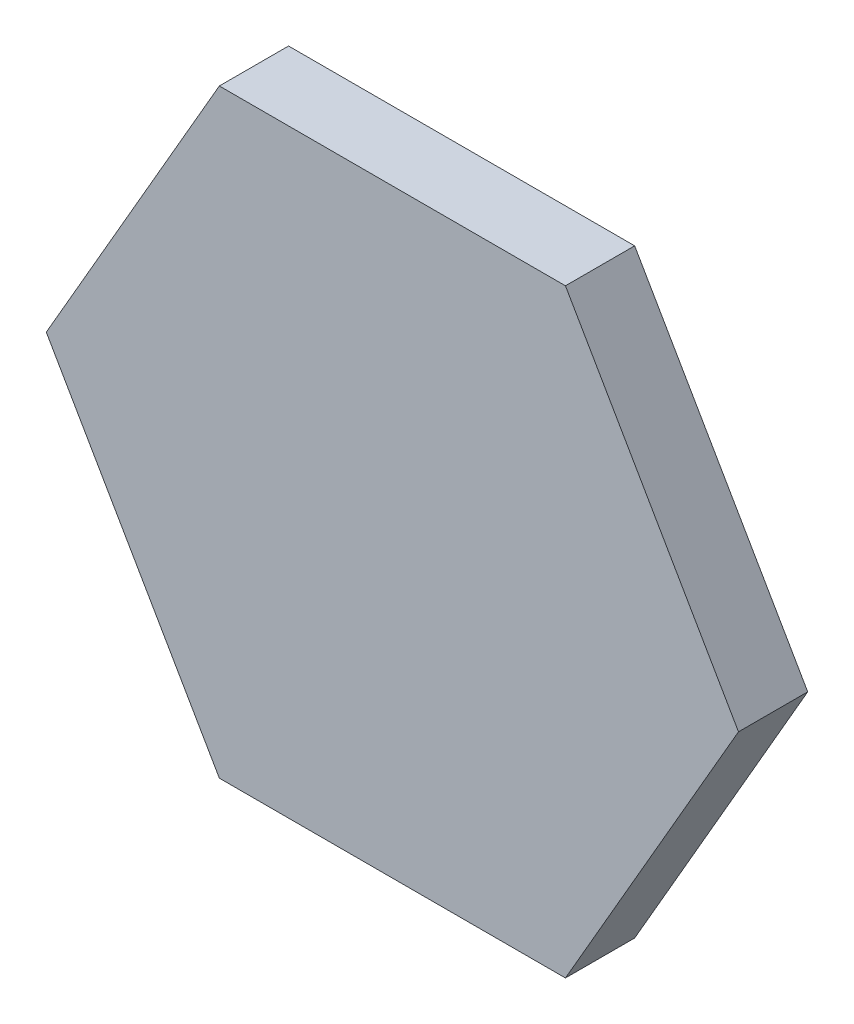
ISO-10303-21;
HEADER;
FILE_DESCRIPTION(('STEP AP214'),'2;1');
FILE_NAME('part.step','',(''),(''),'','','');
FILE_SCHEMA(('AUTOMOTIVE_DESIGN { 1 0 10303 214 1 1 1 1 }'));
ENDSEC;
DATA;
#1=APPLICATION_CONTEXT('core data for automotive mechanical design processes');
#2=APPLICATION_PROTOCOL_DEFINITION('international standard','automotive_design',2000,#1);
#3=PRODUCT_CONTEXT('',#1,'mechanical');
#4=PRODUCT('Part','Part','',(#3));
#5=PRODUCT_RELATED_PRODUCT_CATEGORY('part','',(#4));
#6=PRODUCT_DEFINITION_FORMATION('','',#4);
#7=PRODUCT_DEFINITION_CONTEXT('part definition',#1,'design');
#8=PRODUCT_DEFINITION('design','',#6,#7);
#9=PRODUCT_DEFINITION_SHAPE('','',#8);
#10=(LENGTH_UNIT() NAMED_UNIT(*) SI_UNIT(.MILLI.,.METRE.));
#11=(NAMED_UNIT(*) PLANE_ANGLE_UNIT() SI_UNIT($,.RADIAN.));
#12=(NAMED_UNIT(*) SI_UNIT($,.STERADIAN.) SOLID_ANGLE_UNIT());
#13=UNCERTAINTY_MEASURE_WITH_UNIT(LENGTH_MEASURE(1.E-05),#10,'distance_accuracy_value','');
#14=(GEOMETRIC_REPRESENTATION_CONTEXT(3) GLOBAL_UNCERTAINTY_ASSIGNED_CONTEXT((#13)) GLOBAL_UNIT_ASSIGNED_CONTEXT((#10,
#11,#12)) REPRESENTATION_CONTEXT('',''));
#15=CARTESIAN_POINT('',(0.,0.,0.));
#16=DIRECTION('',(0.,0.,1.));
#17=DIRECTION('',(1.,0.,0.));
#18=AXIS2_PLACEMENT_3D('',#15,#16,#17);
#19=CARTESIAN_POINT('',(-37.5,-64.9519052838329,15.));
#20=DIRECTION('',(0.,1.,0.));
#21=DIRECTION('',(-1.,0.,0.));
#22=AXIS2_PLACEMENT_3D('',#19,#20,#21);
#23=PLANE('',#22);
#24=DIRECTION('',(1.,0.,0.));
#25=VECTOR('',#24,1.);
#26=CARTESIAN_POINT('',(-37.5,-64.9519052838329,0.));
#27=LINE('',#26,#25);
#28=CARTESIAN_POINT('',(-37.5,-64.9519052838329,0.));
#29=VERTEX_POINT('',#28);
#30=CARTESIAN_POINT('',(37.5,-64.9519052838329,0.));
#31=VERTEX_POINT('',#30);
#32=EDGE_CURVE('E128',#29,#31,#27,.T.);
#33=ORIENTED_EDGE('',*,*,#32,.T.);
#34=DIRECTION('',(0.,0.,-1.));
#35=VECTOR('',#34,1.);
#36=CARTESIAN_POINT('',(37.5,-64.9519052838329,15.));
#37=LINE('',#36,#35);
#38=CARTESIAN_POINT('',(37.5,-64.9519052838329,15.));
#39=VERTEX_POINT('',#38);
#40=EDGE_CURVE('E11',#39,#31,#37,.T.);
#41=ORIENTED_EDGE('',*,*,#40,.F.);
#42=DIRECTION('',(1.,0.,0.));
#43=VECTOR('',#42,1.);
#44=CARTESIAN_POINT('',(-37.5,-64.9519052838329,15.));
#45=LINE('',#44,#43);
#46=CARTESIAN_POINT('',(-37.5,-64.9519052838329,15.));
#47=VERTEX_POINT('',#46);
#48=EDGE_CURVE('E144',#47,#39,#45,.T.);
#49=ORIENTED_EDGE('',*,*,#48,.F.);
#50=DIRECTION('',(0.,0.,-1.));
#51=VECTOR('',#50,1.);
#52=CARTESIAN_POINT('',(-37.5,-64.9519052838329,15.));
#53=LINE('',#52,#51);
#54=EDGE_CURVE('E124',#47,#29,#53,.T.);
#55=ORIENTED_EDGE('',*,*,#54,.T.);
#56=EDGE_LOOP('',(#33,#41,#49,#55));
#57=FACE_BOUND('',#56,.T.);
#58=ADVANCED_FACE('F39',(#57),#23,.F.);
#59=CARTESIAN_POINT('',(37.5,-64.9519052838329,15.));
#60=DIRECTION('',(-0.866025403784439,0.5,0.));
#61=DIRECTION('',(-0.5,-0.866025403784439,0.));
#62=AXIS2_PLACEMENT_3D('',#59,#60,#61);
#63=PLANE('',#62);
#64=DIRECTION('',(0.5,0.866025403784439,0.));
#65=VECTOR('',#64,1.);
#66=CARTESIAN_POINT('',(37.5,-64.9519052838329,0.));
#67=LINE('',#66,#65);
#68=CARTESIAN_POINT('',(75.,0.,0.));
#69=VERTEX_POINT('',#68);
#70=EDGE_CURVE('E132',#31,#69,#67,.T.);
#71=ORIENTED_EDGE('',*,*,#70,.T.);
#72=DIRECTION('',(0.,0.,-1.));
#73=VECTOR('',#72,1.);
#74=CARTESIAN_POINT('',(75.,0.,15.));
#75=LINE('',#74,#73);
#76=CARTESIAN_POINT('',(75.,0.,15.));
#77=VERTEX_POINT('',#76);
#78=EDGE_CURVE('E48',#77,#69,#75,.T.);
#79=ORIENTED_EDGE('',*,*,#78,.F.);
#80=DIRECTION('',(0.5,0.866025403784439,0.));
#81=VECTOR('',#80,1.);
#82=CARTESIAN_POINT('',(37.5,-64.9519052838329,15.));
#83=LINE('',#82,#81);
#84=EDGE_CURVE('E93',#39,#77,#83,.T.);
#85=ORIENTED_EDGE('',*,*,#84,.F.);
#86=ORIENTED_EDGE('',*,*,#40,.T.);
#87=EDGE_LOOP('',(#71,#79,#85,#86));
#88=FACE_BOUND('',#87,.T.);
#89=ADVANCED_FACE('F172',(#88),#63,.F.);
#90=CARTESIAN_POINT('',(75.,0.,15.));
#91=DIRECTION('',(-0.866025403784439,-0.5,0.));
#92=DIRECTION('',(0.5,-0.866025403784439,0.));
#93=AXIS2_PLACEMENT_3D('',#90,#91,#92);
#94=PLANE('',#93);
#95=DIRECTION('',(-0.5,0.866025403784439,0.));
#96=VECTOR('',#95,1.);
#97=CARTESIAN_POINT('',(75.,0.,0.));
#98=LINE('',#97,#96);
#99=CARTESIAN_POINT('',(37.5,64.9519052838329,0.));
#100=VERTEX_POINT('',#99);
#101=EDGE_CURVE('E135',#69,#100,#98,.T.);
#102=ORIENTED_EDGE('',*,*,#101,.T.);
#103=DIRECTION('',(0.,0.,-1.));
#104=VECTOR('',#103,1.);
#105=CARTESIAN_POINT('',(37.5,64.9519052838329,15.));
#106=LINE('',#105,#104);
#107=CARTESIAN_POINT('',(37.5,64.9519052838329,15.));
#108=VERTEX_POINT('',#107);
#109=EDGE_CURVE('E117',#108,#100,#106,.T.);
#110=ORIENTED_EDGE('',*,*,#109,.F.);
#111=DIRECTION('',(-0.5,0.866025403784439,0.));
#112=VECTOR('',#111,1.);
#113=CARTESIAN_POINT('',(75.,0.,15.));
#114=LINE('',#113,#112);
#115=EDGE_CURVE('E106',#77,#108,#114,.T.);
#116=ORIENTED_EDGE('',*,*,#115,.F.);
#117=ORIENTED_EDGE('',*,*,#78,.T.);
#118=EDGE_LOOP('',(#102,#110,#116,#117));
#119=FACE_BOUND('',#118,.T.);
#120=ADVANCED_FACE('F154',(#119),#94,.F.);
#121=CARTESIAN_POINT('',(37.5,64.9519052838329,15.));
#122=DIRECTION('',(0.,-1.,0.));
#123=DIRECTION('',(1.,0.,0.));
#124=AXIS2_PLACEMENT_3D('',#121,#122,#123);
#125=PLANE('',#124);
#126=DIRECTION('',(-1.,0.,0.));
#127=VECTOR('',#126,1.);
#128=CARTESIAN_POINT('',(37.5,64.9519052838329,0.));
#129=LINE('',#128,#127);
#130=CARTESIAN_POINT('',(-37.5,64.9519052838329,0.));
#131=VERTEX_POINT('',#130);
#132=EDGE_CURVE('E115',#100,#131,#129,.T.);
#133=ORIENTED_EDGE('',*,*,#132,.T.);
#134=DIRECTION('',(0.,0.,-1.));
#135=VECTOR('',#134,1.);
#136=CARTESIAN_POINT('',(-37.5,64.9519052838329,15.));
#137=LINE('',#136,#135);
#138=CARTESIAN_POINT('',(-37.5,64.9519052838329,15.));
#139=VERTEX_POINT('',#138);
#140=EDGE_CURVE('E112',#139,#131,#137,.T.);
#141=ORIENTED_EDGE('',*,*,#140,.F.);
#142=DIRECTION('',(-1.,0.,0.));
#143=VECTOR('',#142,1.);
#144=CARTESIAN_POINT('',(37.5,64.9519052838329,15.));
#145=LINE('',#144,#143);
#146=EDGE_CURVE('E100',#108,#139,#145,.T.);
#147=ORIENTED_EDGE('',*,*,#146,.F.);
#148=ORIENTED_EDGE('',*,*,#109,.T.);
#149=EDGE_LOOP('',(#133,#141,#147,#148));
#150=FACE_BOUND('',#149,.T.);
#151=ADVANCED_FACE('F113',(#150),#125,.F.);
#152=CARTESIAN_POINT('',(-37.5,64.9519052838329,15.));
#153=DIRECTION('',(0.866025403784439,-0.5,0.));
#154=DIRECTION('',(0.5,0.866025403784439,0.));
#155=AXIS2_PLACEMENT_3D('',#152,#153,#154);
#156=PLANE('',#155);
#157=DIRECTION('',(-0.5,-0.866025403784439,0.));
#158=VECTOR('',#157,1.);
#159=CARTESIAN_POINT('',(-37.5,64.9519052838329,0.));
#160=LINE('',#159,#158);
#161=CARTESIAN_POINT('',(-75.,0.,0.));
#162=VERTEX_POINT('',#161);
#163=EDGE_CURVE('E79',#131,#162,#160,.T.);
#164=ORIENTED_EDGE('',*,*,#163,.T.);
#165=DIRECTION('',(0.,0.,-1.));
#166=VECTOR('',#165,1.);
#167=CARTESIAN_POINT('',(-75.,0.,15.));
#168=LINE('',#167,#166);
#169=CARTESIAN_POINT('',(-75.,0.,15.));
#170=VERTEX_POINT('',#169);
#171=EDGE_CURVE('E118',#170,#162,#168,.T.);
#172=ORIENTED_EDGE('',*,*,#171,.F.);
#173=DIRECTION('',(-0.5,-0.866025403784439,0.));
#174=VECTOR('',#173,1.);
#175=CARTESIAN_POINT('',(-37.5,64.9519052838329,15.));
#176=LINE('',#175,#174);
#177=EDGE_CURVE('E104',#139,#170,#176,.T.);
#178=ORIENTED_EDGE('',*,*,#177,.F.);
#179=ORIENTED_EDGE('',*,*,#140,.T.);
#180=EDGE_LOOP('',(#164,#172,#178,#179));
#181=FACE_BOUND('',#180,.T.);
#182=ADVANCED_FACE('F120',(#181),#156,.F.);
#183=CARTESIAN_POINT('',(-75.,0.,15.));
#184=DIRECTION('',(0.866025403784439,0.5,0.));
#185=DIRECTION('',(-0.5,0.866025403784439,0.));
#186=AXIS2_PLACEMENT_3D('',#183,#184,#185);
#187=PLANE('',#186);
#188=DIRECTION('',(0.5,-0.866025403784439,0.));
#189=VECTOR('',#188,1.);
#190=CARTESIAN_POINT('',(-75.,0.,0.));
#191=LINE('',#190,#189);
#192=EDGE_CURVE('E85',#162,#29,#191,.T.);
#193=ORIENTED_EDGE('',*,*,#192,.T.);
#194=ORIENTED_EDGE('',*,*,#54,.F.);
#195=DIRECTION('',(0.5,-0.866025403784439,0.));
#196=VECTOR('',#195,1.);
#197=CARTESIAN_POINT('',(-75.,0.,15.));
#198=LINE('',#197,#196);
#199=EDGE_CURVE('E56',#170,#47,#198,.T.);
#200=ORIENTED_EDGE('',*,*,#199,.F.);
#201=ORIENTED_EDGE('',*,*,#171,.T.);
#202=EDGE_LOOP('',(#193,#194,#200,#201));
#203=FACE_BOUND('',#202,.T.);
#204=ADVANCED_FACE('F161',(#203),#187,.F.);
#205=CARTESIAN_POINT('',(0.,0.,15.));
#206=DIRECTION('',(0.,0.,1.));
#207=DIRECTION('',(1.,0.,0.));
#208=AXIS2_PLACEMENT_3D('',#205,#206,#207);
#209=PLANE('',#208);
#210=ORIENTED_EDGE('',*,*,#48,.T.);
#211=ORIENTED_EDGE('',*,*,#84,.T.);
#212=ORIENTED_EDGE('',*,*,#115,.T.);
#213=ORIENTED_EDGE('',*,*,#146,.T.);
#214=ORIENTED_EDGE('',*,*,#177,.T.);
#215=ORIENTED_EDGE('',*,*,#199,.T.);
#216=EDGE_LOOP('',(#210,#211,#212,#213,#214,#215));
#217=FACE_BOUND('',#216,.T.);
#218=ADVANCED_FACE('F102',(#217),#209,.T.);
#219=CARTESIAN_POINT('',(0.,0.,0.));
#220=DIRECTION('',(0.,0.,1.));
#221=DIRECTION('',(1.,0.,0.));
#222=AXIS2_PLACEMENT_3D('',#219,#220,#221);
#223=PLANE('',#222);
#224=ORIENTED_EDGE('',*,*,#32,.F.);
#225=ORIENTED_EDGE('',*,*,#192,.F.);
#226=ORIENTED_EDGE('',*,*,#163,.F.);
#227=ORIENTED_EDGE('',*,*,#132,.F.);
#228=ORIENTED_EDGE('',*,*,#101,.F.);
#229=ORIENTED_EDGE('',*,*,#70,.F.);
#230=EDGE_LOOP('',(#224,#225,#226,#227,#228,#229));
#231=FACE_BOUND('',#230,.T.);
#232=ADVANCED_FACE('F157',(#231),#223,.F.);
#233=CLOSED_SHELL('',(#58,#89,#120,#151,#182,#204,#218,#232));
#234=MANIFOLD_SOLID_BREP('B2',#233);
#235=ADVANCED_BREP_SHAPE_REPRESENTATION('',(#18,#234),#14);
#236=SHAPE_DEFINITION_REPRESENTATION(#9,#235);
ENDSEC;
END-ISO-10303-21;
